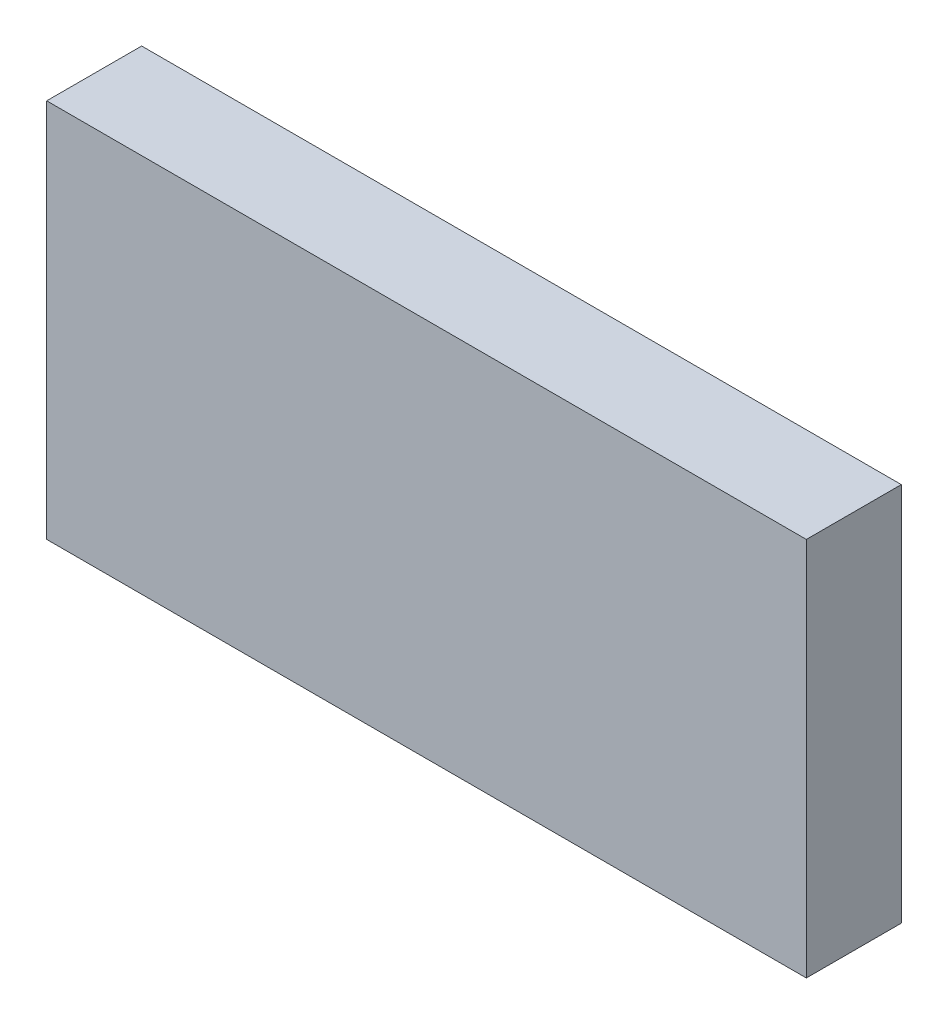
ISO-10303-21;
HEADER;
FILE_DESCRIPTION(('STEP AP214'),'2;1');
FILE_NAME('part.step','',(''),(''),'','','');
FILE_SCHEMA(('AUTOMOTIVE_DESIGN { 1 0 10303 214 1 1 1 1 }'));
ENDSEC;
DATA;
#1=APPLICATION_CONTEXT('core data for automotive mechanical design processes');
#2=APPLICATION_PROTOCOL_DEFINITION('international standard','automotive_design',2000,#1);
#3=PRODUCT_CONTEXT('',#1,'mechanical');
#4=PRODUCT('Part','Part','',(#3));
#5=PRODUCT_RELATED_PRODUCT_CATEGORY('part','',(#4));
#6=PRODUCT_DEFINITION_FORMATION('','',#4);
#7=PRODUCT_DEFINITION_CONTEXT('part definition',#1,'design');
#8=PRODUCT_DEFINITION('design','',#6,#7);
#9=PRODUCT_DEFINITION_SHAPE('','',#8);
#10=(LENGTH_UNIT() NAMED_UNIT(*) SI_UNIT(.MILLI.,.METRE.));
#11=(NAMED_UNIT(*) PLANE_ANGLE_UNIT() SI_UNIT($,.RADIAN.));
#12=(NAMED_UNIT(*) SI_UNIT($,.STERADIAN.) SOLID_ANGLE_UNIT());
#13=UNCERTAINTY_MEASURE_WITH_UNIT(LENGTH_MEASURE(1.E-05),#10,'distance_accuracy_value','');
#14=(GEOMETRIC_REPRESENTATION_CONTEXT(3) GLOBAL_UNCERTAINTY_ASSIGNED_CONTEXT((#13)) GLOBAL_UNIT_ASSIGNED_CONTEXT((#10,
#11,#12)) REPRESENTATION_CONTEXT('',''));
#15=CARTESIAN_POINT('',(0.,0.,0.));
#16=DIRECTION('',(0.,0.,1.));
#17=DIRECTION('',(1.,0.,0.));
#18=AXIS2_PLACEMENT_3D('',#15,#16,#17);
#19=CARTESIAN_POINT('',(40.54983,59.85002,0.622554));
#20=DIRECTION('',(0.,-1.,0.));
#21=DIRECTION('',(0.,0.,-1.));
#22=AXIS2_PLACEMENT_3D('',#19,#20,#21);
#23=PLANE('',#22);
#24=DIRECTION('',(0.,0.,1.));
#25=VECTOR('',#24,1.);
#26=CARTESIAN_POINT('',(38.150038,59.85002,0.32258));
#27=LINE('',#26,#25);
#28=CARTESIAN_POINT('',(38.150038,59.85002,0.32258));
#29=VERTEX_POINT('',#28);
#30=CARTESIAN_POINT('',(38.150038,59.85002,0.622554));
#31=VERTEX_POINT('',#30);
#32=EDGE_CURVE('E11',#29,#31,#27,.T.);
#33=ORIENTED_EDGE('',*,*,#32,.T.);
#34=DIRECTION('',(1.,0.,0.));
#35=VECTOR('',#34,1.);
#36=CARTESIAN_POINT('',(38.150038,59.85002,0.622554));
#37=LINE('',#36,#35);
#38=CARTESIAN_POINT('',(40.54983,59.85002,0.622554));
#39=VERTEX_POINT('',#38);
#40=EDGE_CURVE('E48',#31,#39,#37,.T.);
#41=ORIENTED_EDGE('',*,*,#40,.T.);
#42=DIRECTION('',(0.,0.,1.));
#43=VECTOR('',#42,1.);
#44=CARTESIAN_POINT('',(40.54983,59.85002,0.32258));
#45=LINE('',#44,#43);
#46=CARTESIAN_POINT('',(40.54983,59.85002,0.32258));
#47=VERTEX_POINT('',#46);
#48=EDGE_CURVE('E89',#47,#39,#45,.T.);
#49=ORIENTED_EDGE('',*,*,#48,.F.);
#50=DIRECTION('',(-1.,0.,0.));
#51=VECTOR('',#50,1.);
#52=CARTESIAN_POINT('',(40.54983,59.85002,0.32258));
#53=LINE('',#52,#51);
#54=EDGE_CURVE('E87',#47,#29,#53,.T.);
#55=ORIENTED_EDGE('',*,*,#54,.T.);
#56=EDGE_LOOP('',(#33,#41,#49,#55));
#57=FACE_BOUND('',#56,.T.);
#58=ADVANCED_FACE('F17',(#57),#23,.F.);
#59=CARTESIAN_POINT('',(38.150038,59.85002,0.622554));
#60=DIRECTION('',(1.,0.,0.));
#61=DIRECTION('',(0.,1.,0.));
#62=AXIS2_PLACEMENT_3D('',#59,#60,#61);
#63=PLANE('',#62);
#64=DIRECTION('',(0.,0.,-1.));
#65=VECTOR('',#64,1.);
#66=CARTESIAN_POINT('',(38.150038,58.650124,0.622554));
#67=LINE('',#66,#65);
#68=CARTESIAN_POINT('',(38.150038,58.650124,0.622554));
#69=VERTEX_POINT('',#68);
#70=CARTESIAN_POINT('',(38.150038,58.650124,0.32258));
#71=VERTEX_POINT('',#70);
#72=EDGE_CURVE('E21',#69,#71,#67,.T.);
#73=ORIENTED_EDGE('',*,*,#72,.F.);
#74=DIRECTION('',(0.,1.,0.));
#75=VECTOR('',#74,1.);
#76=CARTESIAN_POINT('',(38.150038,58.650124,0.622554));
#77=LINE('',#76,#75);
#78=EDGE_CURVE('E27',#69,#31,#77,.T.);
#79=ORIENTED_EDGE('',*,*,#78,.T.);
#80=ORIENTED_EDGE('',*,*,#32,.F.);
#81=DIRECTION('',(0.,-1.,0.));
#82=VECTOR('',#81,1.);
#83=CARTESIAN_POINT('',(38.150038,59.85002,0.32258));
#84=LINE('',#83,#82);
#85=EDGE_CURVE('E97',#29,#71,#84,.T.);
#86=ORIENTED_EDGE('',*,*,#85,.T.);
#87=EDGE_LOOP('',(#73,#79,#80,#86));
#88=FACE_BOUND('',#87,.T.);
#89=ADVANCED_FACE('F119',(#88),#63,.F.);
#90=CARTESIAN_POINT('',(0.,0.,0.622554));
#91=DIRECTION('',(0.,0.,1.));
#92=DIRECTION('',(1.,0.,0.));
#93=AXIS2_PLACEMENT_3D('',#90,#91,#92);
#94=PLANE('',#93);
#95=DIRECTION('',(0.,-1.,0.));
#96=VECTOR('',#95,1.);
#97=CARTESIAN_POINT('',(40.54983,59.85002,0.622554));
#98=LINE('',#97,#96);
#99=CARTESIAN_POINT('',(40.54983,58.650124,0.622554));
#100=VERTEX_POINT('',#99);
#101=EDGE_CURVE('E72',#39,#100,#98,.T.);
#102=ORIENTED_EDGE('',*,*,#101,.F.);
#103=ORIENTED_EDGE('',*,*,#40,.F.);
#104=ORIENTED_EDGE('',*,*,#78,.F.);
#105=DIRECTION('',(-1.,0.,0.));
#106=VECTOR('',#105,1.);
#107=CARTESIAN_POINT('',(40.54983,58.650124,0.622554));
#108=LINE('',#107,#106);
#109=EDGE_CURVE('E101',#100,#69,#108,.T.);
#110=ORIENTED_EDGE('',*,*,#109,.F.);
#111=EDGE_LOOP('',(#102,#103,#104,#110));
#112=FACE_BOUND('',#111,.T.);
#113=ADVANCED_FACE('F120',(#112),#94,.T.);
#114=CARTESIAN_POINT('',(40.54983,58.650124,0.622554));
#115=DIRECTION('',(-1.,0.,0.));
#116=DIRECTION('',(0.,0.,1.));
#117=AXIS2_PLACEMENT_3D('',#114,#115,#116);
#118=PLANE('',#117);
#119=ORIENTED_EDGE('',*,*,#48,.T.);
#120=ORIENTED_EDGE('',*,*,#101,.T.);
#121=DIRECTION('',(0.,0.,1.));
#122=VECTOR('',#121,1.);
#123=CARTESIAN_POINT('',(40.54983,58.650124,0.32258));
#124=LINE('',#123,#122);
#125=CARTESIAN_POINT('',(40.54983,58.650124,0.32258));
#126=VERTEX_POINT('',#125);
#127=EDGE_CURVE('E95',#126,#100,#124,.T.);
#128=ORIENTED_EDGE('',*,*,#127,.F.);
#129=DIRECTION('',(0.,1.,0.));
#130=VECTOR('',#129,1.);
#131=CARTESIAN_POINT('',(40.54983,58.650124,0.32258));
#132=LINE('',#131,#130);
#133=EDGE_CURVE('E82',#126,#47,#132,.T.);
#134=ORIENTED_EDGE('',*,*,#133,.T.);
#135=EDGE_LOOP('',(#119,#120,#128,#134));
#136=FACE_BOUND('',#135,.T.);
#137=ADVANCED_FACE('F99',(#136),#118,.F.);
#138=CARTESIAN_POINT('',(0.,0.,0.32258));
#139=DIRECTION('',(0.,0.,1.));
#140=DIRECTION('',(1.,0.,0.));
#141=AXIS2_PLACEMENT_3D('',#138,#139,#140);
#142=PLANE('',#141);
#143=ORIENTED_EDGE('',*,*,#85,.F.);
#144=ORIENTED_EDGE('',*,*,#54,.F.);
#145=ORIENTED_EDGE('',*,*,#133,.F.);
#146=DIRECTION('',(1.,0.,0.));
#147=VECTOR('',#146,1.);
#148=CARTESIAN_POINT('',(38.150038,58.650124,0.32258));
#149=LINE('',#148,#147);
#150=EDGE_CURVE('E85',#71,#126,#149,.T.);
#151=ORIENTED_EDGE('',*,*,#150,.F.);
#152=EDGE_LOOP('',(#143,#144,#145,#151));
#153=FACE_BOUND('',#152,.T.);
#154=ADVANCED_FACE('F19',(#153),#142,.F.);
#155=CARTESIAN_POINT('',(38.150038,58.650124,0.622554));
#156=DIRECTION('',(0.,1.,0.));
#157=DIRECTION('',(1.,0.,0.));
#158=AXIS2_PLACEMENT_3D('',#155,#156,#157);
#159=PLANE('',#158);
#160=ORIENTED_EDGE('',*,*,#127,.T.);
#161=ORIENTED_EDGE('',*,*,#109,.T.);
#162=ORIENTED_EDGE('',*,*,#72,.T.);
#163=ORIENTED_EDGE('',*,*,#150,.T.);
#164=EDGE_LOOP('',(#160,#161,#162,#163));
#165=FACE_BOUND('',#164,.T.);
#166=ADVANCED_FACE('F93',(#165),#159,.F.);
#167=CLOSED_SHELL('',(#58,#89,#113,#137,#154,#166));
#168=MANIFOLD_SOLID_BREP('B1',#167);
#169=ADVANCED_BREP_SHAPE_REPRESENTATION('',(#18,#168),#14);
#170=SHAPE_DEFINITION_REPRESENTATION(#9,#169);
ENDSEC;
END-ISO-10303-21;
